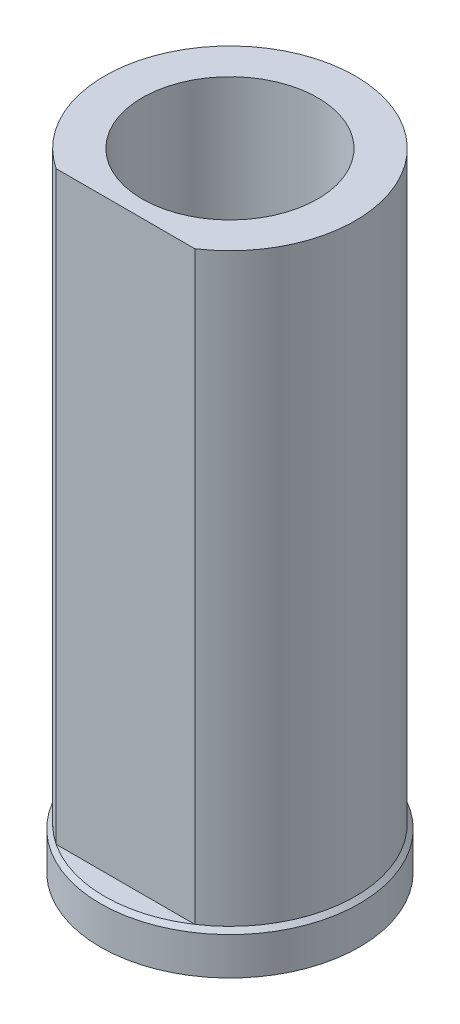
ISO-10303-21;
HEADER;
FILE_DESCRIPTION(('STEP AP214'),'2;1');
FILE_NAME('part.step','',(''),(''),'','','');
FILE_SCHEMA(('AUTOMOTIVE_DESIGN { 1 0 10303 214 1 1 1 1 }'));
ENDSEC;
DATA;
#1=APPLICATION_CONTEXT('core data for automotive mechanical design processes');
#2=APPLICATION_PROTOCOL_DEFINITION('international standard','automotive_design',2000,#1);
#3=PRODUCT_CONTEXT('',#1,'mechanical');
#4=PRODUCT('Part','Part','',(#3));
#5=PRODUCT_RELATED_PRODUCT_CATEGORY('part','',(#4));
#6=PRODUCT_DEFINITION_FORMATION('','',#4);
#7=PRODUCT_DEFINITION_CONTEXT('part definition',#1,'design');
#8=PRODUCT_DEFINITION('design','',#6,#7);
#9=PRODUCT_DEFINITION_SHAPE('','',#8);
#10=(LENGTH_UNIT() NAMED_UNIT(*) SI_UNIT(.MILLI.,.METRE.));
#11=(NAMED_UNIT(*) PLANE_ANGLE_UNIT() SI_UNIT($,.RADIAN.));
#12=(NAMED_UNIT(*) SI_UNIT($,.STERADIAN.) SOLID_ANGLE_UNIT());
#13=UNCERTAINTY_MEASURE_WITH_UNIT(LENGTH_MEASURE(1.E-05),#10,'distance_accuracy_value','');
#14=(GEOMETRIC_REPRESENTATION_CONTEXT(3) GLOBAL_UNCERTAINTY_ASSIGNED_CONTEXT((#13)) GLOBAL_UNIT_ASSIGNED_CONTEXT((#10,
#11,#12)) REPRESENTATION_CONTEXT('',''));
#15=CARTESIAN_POINT('',(0.,0.,0.));
#16=DIRECTION('',(0.,0.,1.));
#17=DIRECTION('',(1.,0.,0.));
#18=AXIS2_PLACEMENT_3D('',#15,#16,#17);
#19=CARTESIAN_POINT('',(0.,15.,0.));
#20=DIRECTION('',(0.,-1.,0.));
#21=DIRECTION('',(0.,0.,-1.));
#22=AXIS2_PLACEMENT_3D('',#19,#20,#21);
#23=CYLINDRICAL_SURFACE('',#22,3.);
#24=DIRECTION('',(0.,1.,0.));
#25=VECTOR('',#24,1.);
#26=CARTESIAN_POINT('',(-1.6583123951777,0.999999999999999,2.5));
#27=LINE('',#26,#25);
#28=CARTESIAN_POINT('',(-1.6583123951777,1.,2.5));
#29=VERTEX_POINT('',#28);
#30=CARTESIAN_POINT('',(-1.6583123951777,15.,2.5));
#31=VERTEX_POINT('',#30);
#32=EDGE_CURVE('E64',#29,#31,#27,.T.);
#33=ORIENTED_EDGE('',*,*,#32,.T.);
#34=CARTESIAN_POINT('',(0.,15.,0.));
#35=DIRECTION('',(0.,1.,0.));
#36=DIRECTION('',(0.,0.,1.));
#37=AXIS2_PLACEMENT_3D('',#34,#35,#36);
#38=CIRCLE('',#37,3.);
#39=CARTESIAN_POINT('',(1.6583123951777,15.,2.5));
#40=VERTEX_POINT('',#39);
#41=EDGE_CURVE('E12',#40,#31,#38,.T.);
#42=ORIENTED_EDGE('',*,*,#41,.F.);
#43=DIRECTION('',(0.,1.,0.));
#44=VECTOR('',#43,1.);
#45=CARTESIAN_POINT('',(1.6583123951777,0.999999999999999,2.5));
#46=LINE('',#45,#44);
#47=CARTESIAN_POINT('',(1.6583123951777,0.999999999999999,2.5));
#48=VERTEX_POINT('',#47);
#49=EDGE_CURVE('E74',#48,#40,#46,.T.);
#50=ORIENTED_EDGE('',*,*,#49,.F.);
#51=CARTESIAN_POINT('',(0.,1.,0.));
#52=DIRECTION('',(0.,1.,0.));
#53=DIRECTION('',(0.,0.,1.));
#54=AXIS2_PLACEMENT_3D('',#51,#52,#53);
#55=CIRCLE('',#54,3.);
#56=EDGE_CURVE('E57',#48,#29,#55,.T.);
#57=ORIENTED_EDGE('',*,*,#56,.T.);
#58=EDGE_LOOP('',(#33,#42,#50,#57));
#59=FACE_BOUND('',#58,.T.);
#60=ADVANCED_FACE('F48',(#59),#23,.T.);
#61=CARTESIAN_POINT('',(0.,15.,0.));
#62=DIRECTION('',(0.,1.,0.));
#63=DIRECTION('',(0.,0.,1.));
#64=AXIS2_PLACEMENT_3D('',#61,#62,#63);
#65=PLANE('',#64);
#66=CARTESIAN_POINT('',(0.,15.,0.));
#67=DIRECTION('',(0.,1.,0.));
#68=DIRECTION('',(0.,0.,1.));
#69=AXIS2_PLACEMENT_3D('',#66,#67,#68);
#70=CIRCLE('',#69,2.1);
#71=CARTESIAN_POINT('',(0.,15.,2.1));
#72=VERTEX_POINT('',#71);
#73=EDGE_CURVE('E87',#72,#72,#70,.T.);
#74=ORIENTED_EDGE('',*,*,#73,.F.);
#75=EDGE_LOOP('',(#74));
#76=FACE_BOUND('',#75,.T.);
#77=ORIENTED_EDGE('',*,*,#41,.T.);
#78=DIRECTION('',(1.,0.,0.));
#79=VECTOR('',#78,1.);
#80=CARTESIAN_POINT('',(0.,15.,2.5));
#81=LINE('',#80,#79);
#82=EDGE_CURVE('E51',#31,#40,#81,.T.);
#83=ORIENTED_EDGE('',*,*,#82,.T.);
#84=EDGE_LOOP('',(#77,#83));
#85=FACE_BOUND('',#84,.T.);
#86=ADVANCED_FACE('F100',(#76,#85),#65,.T.);
#87=CARTESIAN_POINT('',(0.,1.,0.));
#88=DIRECTION('',(0.,1.,0.));
#89=DIRECTION('',(0.,0.,1.));
#90=AXIS2_PLACEMENT_3D('',#87,#88,#89);
#91=PLANE('',#90);
#92=CARTESIAN_POINT('',(0.,0.999999999999999,0.));
#93=DIRECTION('',(0.,1.,0.));
#94=DIRECTION('',(0.,0.,1.));
#95=AXIS2_PLACEMENT_3D('',#92,#93,#94);
#96=CIRCLE('',#95,2.1);
#97=CARTESIAN_POINT('',(0.,0.999999999999999,2.1));
#98=VERTEX_POINT('',#97);
#99=EDGE_CURVE('E78',#98,#98,#96,.T.);
#100=ORIENTED_EDGE('',*,*,#99,.T.);
#101=EDGE_LOOP('',(#100));
#102=FACE_BOUND('',#101,.T.);
#103=DIRECTION('',(1.,0.,0.));
#104=VECTOR('',#103,1.);
#105=CARTESIAN_POINT('',(0.,0.999999999999999,2.5));
#106=LINE('',#105,#104);
#107=EDGE_CURVE('E71',#29,#48,#106,.T.);
#108=ORIENTED_EDGE('',*,*,#107,.F.);
#109=ORIENTED_EDGE('',*,*,#56,.F.);
#110=EDGE_LOOP('',(#108,#109));
#111=FACE_BOUND('',#110,.T.);
#112=ADVANCED_FACE('F83',(#102,#111),#91,.F.);
#113=CARTESIAN_POINT('',(0.,0.999999999999999,2.5));
#114=DIRECTION('',(0.,0.,1.));
#115=DIRECTION('',(1.,0.,0.));
#116=AXIS2_PLACEMENT_3D('',#113,#114,#115);
#117=PLANE('',#116);
#118=ORIENTED_EDGE('',*,*,#32,.F.);
#119=ORIENTED_EDGE('',*,*,#107,.T.);
#120=ORIENTED_EDGE('',*,*,#49,.T.);
#121=ORIENTED_EDGE('',*,*,#82,.F.);
#122=EDGE_LOOP('',(#118,#119,#120,#121));
#123=FACE_BOUND('',#122,.T.);
#124=ADVANCED_FACE('F73',(#123),#117,.T.);
#125=CARTESIAN_POINT('',(0.,0.999999999999999,0.));
#126=DIRECTION('',(0.,1.,0.));
#127=DIRECTION('',(0.,0.,1.));
#128=AXIS2_PLACEMENT_3D('',#125,#126,#127);
#129=CYLINDRICAL_SURFACE('',#128,2.1);
#130=ORIENTED_EDGE('',*,*,#99,.F.);
#131=EDGE_LOOP('',(#130));
#132=FACE_BOUND('',#131,.T.);
#133=ORIENTED_EDGE('',*,*,#73,.T.);
#134=EDGE_LOOP('',(#133));
#135=FACE_BOUND('',#134,.T.);
#136=ADVANCED_FACE('F94',(#132,#135),#129,.F.);
#137=CLOSED_SHELL('',(#60,#86,#112,#124,#136));
#138=MANIFOLD_SOLID_BREP('B2',#137);
#139=CARTESIAN_POINT('',(0.,1.,0.));
#140=DIRECTION('',(0.,-1.,0.));
#141=DIRECTION('',(0.,0.,-1.));
#142=AXIS2_PLACEMENT_3D('',#139,#140,#141);
#143=CYLINDRICAL_SURFACE('',#142,3.1);
#144=CARTESIAN_POINT('',(0.,0.899999999999999,0.));
#145=DIRECTION('',(0.,1.,0.));
#146=DIRECTION('',(0.,0.,1.));
#147=AXIS2_PLACEMENT_3D('',#144,#145,#146);
#148=CIRCLE('',#147,3.1);
#149=CARTESIAN_POINT('',(0.,0.899999999999999,3.1));
#150=VERTEX_POINT('',#149);
#151=EDGE_CURVE('E47',#150,#150,#148,.F.);
#152=ORIENTED_EDGE('',*,*,#151,.T.);
#153=EDGE_LOOP('',(#152));
#154=FACE_BOUND('',#153,.T.);
#155=CARTESIAN_POINT('',(0.,0.,0.));
#156=DIRECTION('',(0.,1.,0.));
#157=DIRECTION('',(0.,0.,1.));
#158=AXIS2_PLACEMENT_3D('',#155,#156,#157);
#159=CIRCLE('',#158,3.1);
#160=CARTESIAN_POINT('',(0.,0.,3.1));
#161=VERTEX_POINT('',#160);
#162=EDGE_CURVE('E162',#161,#161,#159,.T.);
#163=ORIENTED_EDGE('',*,*,#162,.T.);
#164=EDGE_LOOP('',(#163));
#165=FACE_BOUND('',#164,.T.);
#166=ADVANCED_FACE('F150',(#154,#165),#143,.T.);
#167=CARTESIAN_POINT('',(0.,1.,0.));
#168=DIRECTION('',(0.,1.,0.));
#169=DIRECTION('',(0.,0.,1.));
#170=AXIS2_PLACEMENT_3D('',#167,#168,#169);
#171=PLANE('',#170);
#172=CARTESIAN_POINT('',(0.,1.,0.));
#173=DIRECTION('',(0.,1.,0.));
#174=DIRECTION('',(0.,0.,1.));
#175=AXIS2_PLACEMENT_3D('',#172,#173,#174);
#176=CIRCLE('',#175,3.);
#177=CARTESIAN_POINT('',(0.,1.,3.));
#178=VERTEX_POINT('',#177);
#179=EDGE_CURVE('E158',#178,#178,#176,.T.);
#180=ORIENTED_EDGE('',*,*,#179,.T.);
#181=EDGE_LOOP('',(#180));
#182=FACE_BOUND('',#181,.T.);
#183=ADVANCED_FACE('F172',(#182),#171,.T.);
#184=CARTESIAN_POINT('',(0.,0.,0.));
#185=DIRECTION('',(0.,1.,0.));
#186=DIRECTION('',(0.,0.,1.));
#187=AXIS2_PLACEMENT_3D('',#184,#185,#186);
#188=PLANE('',#187);
#189=ORIENTED_EDGE('',*,*,#162,.F.);
#190=EDGE_LOOP('',(#189));
#191=FACE_BOUND('',#190,.T.);
#192=ADVANCED_FACE('F170',(#191),#188,.F.);
#193=CARTESIAN_POINT('',(0.,1.,0.));
#194=DIRECTION('',(0.,-1.,0.));
#195=DIRECTION('',(0.,0.,-1.));
#196=AXIS2_PLACEMENT_3D('',#193,#194,#195);
#197=CONICAL_SURFACE('',#196,3.,0.78539816339745);
#198=ORIENTED_EDGE('',*,*,#151,.F.);
#199=EDGE_LOOP('',(#198));
#200=FACE_BOUND('',#199,.T.);
#201=ORIENTED_EDGE('',*,*,#179,.F.);
#202=EDGE_LOOP('',(#201));
#203=FACE_BOUND('',#202,.T.);
#204=ADVANCED_FACE('F153',(#200,#203),#197,.T.);
#205=CLOSED_SHELL('',(#166,#183,#192,#204));
#206=MANIFOLD_SOLID_BREP('B6',#205);
#207=ADVANCED_BREP_SHAPE_REPRESENTATION('',(#18,#138,#206),#14);
#208=SHAPE_DEFINITION_REPRESENTATION(#9,#207);
ENDSEC;
END-ISO-10303-21;
